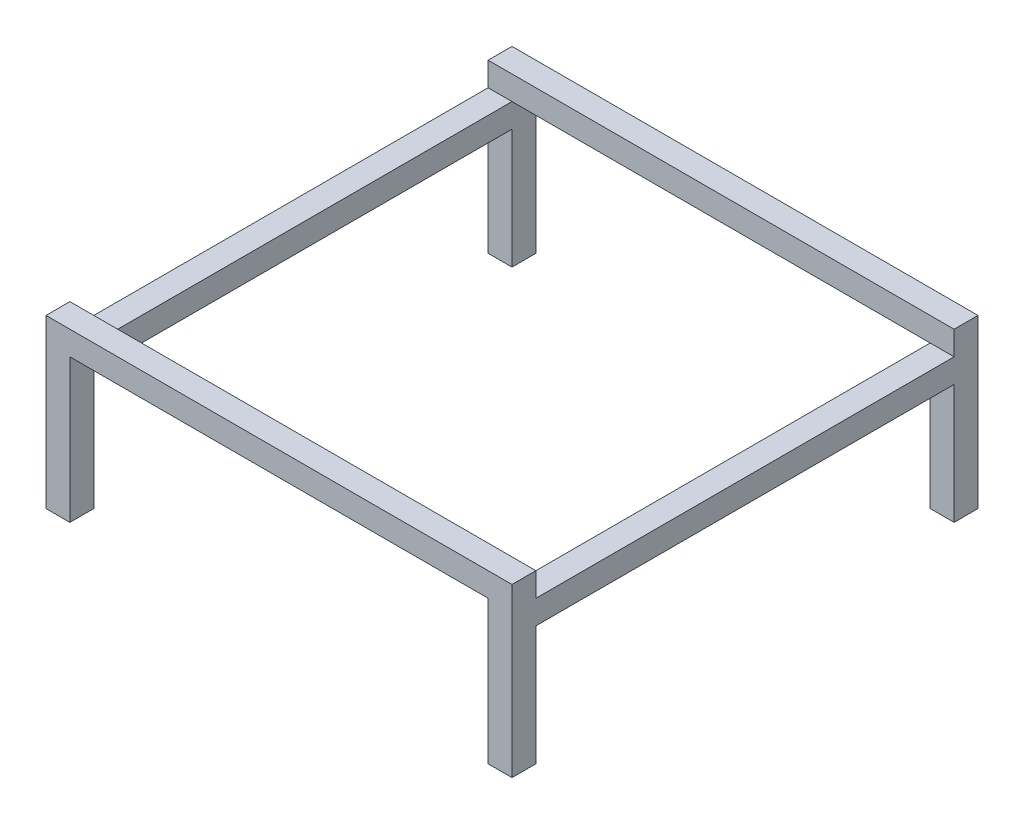
ISO-10303-21;
HEADER;
FILE_DESCRIPTION(('STEP AP214'),'2;1');
FILE_NAME('part.step','',(''),(''),'','','');
FILE_SCHEMA(('AUTOMOTIVE_DESIGN { 1 0 10303 214 1 1 1 1 }'));
ENDSEC;
DATA;
#1=APPLICATION_CONTEXT('core data for automotive mechanical design processes');
#2=APPLICATION_PROTOCOL_DEFINITION('international standard','automotive_design',2000,#1);
#3=PRODUCT_CONTEXT('',#1,'mechanical');
#4=PRODUCT('Part','Part','',(#3));
#5=PRODUCT_RELATED_PRODUCT_CATEGORY('part','',(#4));
#6=PRODUCT_DEFINITION_FORMATION('','',#4);
#7=PRODUCT_DEFINITION_CONTEXT('part definition',#1,'design');
#8=PRODUCT_DEFINITION('design','',#6,#7);
#9=PRODUCT_DEFINITION_SHAPE('','',#8);
#10=(LENGTH_UNIT() NAMED_UNIT(*) SI_UNIT(.MILLI.,.METRE.));
#11=(NAMED_UNIT(*) PLANE_ANGLE_UNIT() SI_UNIT($,.RADIAN.));
#12=(NAMED_UNIT(*) SI_UNIT($,.STERADIAN.) SOLID_ANGLE_UNIT());
#13=UNCERTAINTY_MEASURE_WITH_UNIT(LENGTH_MEASURE(1.E-05),#10,'distance_accuracy_value','');
#14=(GEOMETRIC_REPRESENTATION_CONTEXT(3) GLOBAL_UNCERTAINTY_ASSIGNED_CONTEXT((#13)) GLOBAL_UNIT_ASSIGNED_CONTEXT((#10,
#11,#12)) REPRESENTATION_CONTEXT('',''));
#15=CARTESIAN_POINT('',(0.,0.,0.));
#16=DIRECTION('',(0.,0.,1.));
#17=DIRECTION('',(1.,0.,0.));
#18=AXIS2_PLACEMENT_3D('',#15,#16,#17);
#19=CARTESIAN_POINT('',(0.,20.,0.));
#20=DIRECTION('',(0.,-1.,0.));
#21=DIRECTION('',(0.,0.,-1.));
#22=AXIS2_PLACEMENT_3D('',#19,#20,#21);
#23=PLANE('',#22);
#24=DIRECTION('',(1.,0.,0.));
#25=VECTOR('',#24,1.);
#26=CARTESIAN_POINT('',(-195.,20.,-175.));
#27=LINE('',#26,#25);
#28=CARTESIAN_POINT('',(-195.,20.,-175.));
#29=VERTEX_POINT('',#28);
#30=CARTESIAN_POINT('',(-175.,20.,-175.));
#31=VERTEX_POINT('',#30);
#32=EDGE_CURVE('E228',#29,#31,#27,.T.);
#33=ORIENTED_EDGE('',*,*,#32,.F.);
#34=DIRECTION('',(0.,0.,1.));
#35=VECTOR('',#34,1.);
#36=CARTESIAN_POINT('',(-195.,20.,195.));
#37=LINE('',#36,#35);
#38=CARTESIAN_POINT('',(-195.,20.,175.));
#39=VERTEX_POINT('',#38);
#40=EDGE_CURVE('E343',#29,#39,#37,.T.);
#41=ORIENTED_EDGE('',*,*,#40,.T.);
#42=DIRECTION('',(-1.,0.,0.));
#43=VECTOR('',#42,1.);
#44=CARTESIAN_POINT('',(-195.,20.,175.));
#45=LINE('',#44,#43);
#46=CARTESIAN_POINT('',(-175.,20.,175.));
#47=VERTEX_POINT('',#46);
#48=EDGE_CURVE('E43',#47,#39,#45,.T.);
#49=ORIENTED_EDGE('',*,*,#48,.F.);
#50=DIRECTION('',(0.,0.,1.));
#51=VECTOR('',#50,1.);
#52=CARTESIAN_POINT('',(-175.,20.,175.));
#53=LINE('',#52,#51);
#54=EDGE_CURVE('E332',#31,#47,#53,.T.);
#55=ORIENTED_EDGE('',*,*,#54,.F.);
#56=EDGE_LOOP('',(#33,#41,#49,#55));
#57=FACE_BOUND('',#56,.T.);
#58=ADVANCED_FACE('F35',(#57),#23,.F.);
#59=CARTESIAN_POINT('',(175.,20.,-175.));
#60=VERTEX_POINT('',#59);
#61=CARTESIAN_POINT('',(195.,20.,-175.));
#62=VERTEX_POINT('',#61);
#63=EDGE_CURVE('E223',#60,#62,#27,.T.);
#64=ORIENTED_EDGE('',*,*,#63,.F.);
#65=DIRECTION('',(0.,0.,-1.));
#66=VECTOR('',#65,1.);
#67=CARTESIAN_POINT('',(175.,20.,175.));
#68=LINE('',#67,#66);
#69=CARTESIAN_POINT('',(175.,20.,175.));
#70=VERTEX_POINT('',#69);
#71=EDGE_CURVE('E204',#70,#60,#68,.T.);
#72=ORIENTED_EDGE('',*,*,#71,.F.);
#73=CARTESIAN_POINT('',(195.,20.,175.));
#74=VERTEX_POINT('',#73);
#75=EDGE_CURVE('E50',#74,#70,#45,.T.);
#76=ORIENTED_EDGE('',*,*,#75,.F.);
#77=DIRECTION('',(0.,0.,-1.));
#78=VECTOR('',#77,1.);
#79=CARTESIAN_POINT('',(195.,20.,195.));
#80=LINE('',#79,#78);
#81=EDGE_CURVE('E341',#74,#62,#80,.T.);
#82=ORIENTED_EDGE('',*,*,#81,.T.);
#83=EDGE_LOOP('',(#64,#72,#76,#82));
#84=FACE_BOUND('',#83,.T.);
#85=ADVANCED_FACE('F380',(#84),#23,.F.);
#86=CARTESIAN_POINT('',(0.,0.,0.));
#87=DIRECTION('',(0.,-1.,0.));
#88=DIRECTION('',(0.,0.,-1.));
#89=AXIS2_PLACEMENT_3D('',#86,#87,#88);
#90=PLANE('',#89);
#91=DIRECTION('',(0.,0.,1.));
#92=VECTOR('',#91,1.);
#93=CARTESIAN_POINT('',(-195.,0.,195.));
#94=LINE('',#93,#92);
#95=CARTESIAN_POINT('',(-195.,0.,-175.));
#96=VERTEX_POINT('',#95);
#97=CARTESIAN_POINT('',(-195.,0.,175.));
#98=VERTEX_POINT('',#97);
#99=EDGE_CURVE('E344',#96,#98,#94,.T.);
#100=ORIENTED_EDGE('',*,*,#99,.F.);
#101=DIRECTION('',(-1.,0.,0.));
#102=VECTOR('',#101,1.);
#103=CARTESIAN_POINT('',(-195.,0.,-175.));
#104=LINE('',#103,#102);
#105=CARTESIAN_POINT('',(-175.,0.,-175.));
#106=VERTEX_POINT('',#105);
#107=EDGE_CURVE('E260',#106,#96,#104,.T.);
#108=ORIENTED_EDGE('',*,*,#107,.F.);
#109=DIRECTION('',(0.,0.,1.));
#110=VECTOR('',#109,1.);
#111=CARTESIAN_POINT('',(-175.,0.,175.));
#112=LINE('',#111,#110);
#113=CARTESIAN_POINT('',(-175.,0.,175.));
#114=VERTEX_POINT('',#113);
#115=EDGE_CURVE('E331',#106,#114,#112,.T.);
#116=ORIENTED_EDGE('',*,*,#115,.T.);
#117=DIRECTION('',(1.,0.,0.));
#118=VECTOR('',#117,1.);
#119=CARTESIAN_POINT('',(-195.,0.,175.));
#120=LINE('',#119,#118);
#121=EDGE_CURVE('E310',#98,#114,#120,.T.);
#122=ORIENTED_EDGE('',*,*,#121,.F.);
#123=EDGE_LOOP('',(#100,#108,#116,#122));
#124=FACE_BOUND('',#123,.T.);
#125=ADVANCED_FACE('F435',(#124),#90,.T.);
#126=DIRECTION('',(0.,0.,-1.));
#127=VECTOR('',#126,1.);
#128=CARTESIAN_POINT('',(175.,0.,175.));
#129=LINE('',#128,#127);
#130=CARTESIAN_POINT('',(175.,0.,175.));
#131=VERTEX_POINT('',#130);
#132=CARTESIAN_POINT('',(175.,0.,-175.));
#133=VERTEX_POINT('',#132);
#134=EDGE_CURVE('E335',#131,#133,#129,.T.);
#135=ORIENTED_EDGE('',*,*,#134,.T.);
#136=DIRECTION('',(-1.,0.,0.));
#137=VECTOR('',#136,1.);
#138=CARTESIAN_POINT('',(195.,0.,-175.));
#139=LINE('',#138,#137);
#140=CARTESIAN_POINT('',(195.,0.,-175.));
#141=VERTEX_POINT('',#140);
#142=EDGE_CURVE('E277',#141,#133,#139,.T.);
#143=ORIENTED_EDGE('',*,*,#142,.F.);
#144=DIRECTION('',(0.,0.,-1.));
#145=VECTOR('',#144,1.);
#146=CARTESIAN_POINT('',(195.,0.,195.));
#147=LINE('',#146,#145);
#148=CARTESIAN_POINT('',(195.,0.,175.));
#149=VERTEX_POINT('',#148);
#150=EDGE_CURVE('E337',#149,#141,#147,.T.);
#151=ORIENTED_EDGE('',*,*,#150,.F.);
#152=DIRECTION('',(1.,0.,0.));
#153=VECTOR('',#152,1.);
#154=CARTESIAN_POINT('',(195.,0.,175.));
#155=LINE('',#154,#153);
#156=EDGE_CURVE('E291',#131,#149,#155,.T.);
#157=ORIENTED_EDGE('',*,*,#156,.F.);
#158=EDGE_LOOP('',(#135,#143,#151,#157));
#159=FACE_BOUND('',#158,.T.);
#160=ADVANCED_FACE('F407',(#159),#90,.T.);
#161=CARTESIAN_POINT('',(195.,20.,195.));
#162=DIRECTION('',(0.,0.,-1.));
#163=DIRECTION('',(-1.,0.,0.));
#164=AXIS2_PLACEMENT_3D('',#161,#162,#163);
#165=PLANE('',#164);
#166=DIRECTION('',(0.,1.,0.));
#167=VECTOR('',#166,1.);
#168=CARTESIAN_POINT('',(-175.,-100.,195.));
#169=LINE('',#168,#167);
#170=CARTESIAN_POINT('',(-175.,-100.,195.));
#171=VERTEX_POINT('',#170);
#172=CARTESIAN_POINT('',(-175.,20.,195.));
#173=VERTEX_POINT('',#172);
#174=EDGE_CURVE('E321',#171,#173,#169,.T.);
#175=ORIENTED_EDGE('',*,*,#174,.T.);
#176=DIRECTION('',(1.,0.,0.));
#177=VECTOR('',#176,1.);
#178=CARTESIAN_POINT('',(195.,20.,195.));
#179=LINE('',#178,#177);
#180=CARTESIAN_POINT('',(175.,20.,195.));
#181=VERTEX_POINT('',#180);
#182=EDGE_CURVE('E220',#173,#181,#179,.T.);
#183=ORIENTED_EDGE('',*,*,#182,.T.);
#184=DIRECTION('',(0.,1.,0.));
#185=VECTOR('',#184,1.);
#186=CARTESIAN_POINT('',(175.,-100.,195.));
#187=LINE('',#186,#185);
#188=CARTESIAN_POINT('',(175.,-100.,195.));
#189=VERTEX_POINT('',#188);
#190=EDGE_CURVE('E308',#189,#181,#187,.T.);
#191=ORIENTED_EDGE('',*,*,#190,.F.);
#192=DIRECTION('',(-1.,0.,0.));
#193=VECTOR('',#192,1.);
#194=CARTESIAN_POINT('',(195.,-100.,195.));
#195=LINE('',#194,#193);
#196=CARTESIAN_POINT('',(195.,-100.,195.));
#197=VERTEX_POINT('',#196);
#198=EDGE_CURVE('E292',#197,#189,#195,.T.);
#199=ORIENTED_EDGE('',*,*,#198,.F.);
#200=DIRECTION('',(0.,-1.,0.));
#201=VECTOR('',#200,1.);
#202=CARTESIAN_POINT('',(195.,20.,195.));
#203=LINE('',#202,#201);
#204=CARTESIAN_POINT('',(195.,40.,195.));
#205=VERTEX_POINT('',#204);
#206=EDGE_CURVE('E354',#205,#197,#203,.T.);
#207=ORIENTED_EDGE('',*,*,#206,.F.);
#208=DIRECTION('',(1.,0.,0.));
#209=VECTOR('',#208,1.);
#210=CARTESIAN_POINT('',(-195.,40.,195.));
#211=LINE('',#210,#209);
#212=CARTESIAN_POINT('',(-195.,40.,195.));
#213=VERTEX_POINT('',#212);
#214=EDGE_CURVE('E246',#213,#205,#211,.T.);
#215=ORIENTED_EDGE('',*,*,#214,.F.);
#216=DIRECTION('',(0.,-1.,0.));
#217=VECTOR('',#216,1.);
#218=CARTESIAN_POINT('',(-195.,20.,195.));
#219=LINE('',#218,#217);
#220=CARTESIAN_POINT('',(-195.,-100.,195.));
#221=VERTEX_POINT('',#220);
#222=EDGE_CURVE('E346',#213,#221,#219,.T.);
#223=ORIENTED_EDGE('',*,*,#222,.T.);
#224=DIRECTION('',(-1.,0.,0.));
#225=VECTOR('',#224,1.);
#226=CARTESIAN_POINT('',(-195.,-100.,195.));
#227=LINE('',#226,#225);
#228=EDGE_CURVE('E318',#171,#221,#227,.T.);
#229=ORIENTED_EDGE('',*,*,#228,.F.);
#230=EDGE_LOOP('',(#175,#183,#191,#199,#207,#215,#223,#229));
#231=FACE_BOUND('',#230,.T.);
#232=ADVANCED_FACE('F37',(#231),#165,.F.);
#233=CARTESIAN_POINT('',(195.,20.,195.));
#234=DIRECTION('',(-1.,0.,0.));
#235=DIRECTION('',(0.,0.,1.));
#236=AXIS2_PLACEMENT_3D('',#233,#234,#235);
#237=PLANE('',#236);
#238=ORIENTED_EDGE('',*,*,#206,.T.);
#239=DIRECTION('',(0.,0.,1.));
#240=VECTOR('',#239,1.);
#241=CARTESIAN_POINT('',(195.,-100.,195.));
#242=LINE('',#241,#240);
#243=CARTESIAN_POINT('',(195.,-100.,175.));
#244=VERTEX_POINT('',#243);
#245=EDGE_CURVE('E299',#244,#197,#242,.T.);
#246=ORIENTED_EDGE('',*,*,#245,.F.);
#247=DIRECTION('',(0.,1.,0.));
#248=VECTOR('',#247,1.);
#249=CARTESIAN_POINT('',(195.,-100.,175.));
#250=LINE('',#249,#248);
#251=EDGE_CURVE('E302',#244,#149,#250,.T.);
#252=ORIENTED_EDGE('',*,*,#251,.T.);
#253=ORIENTED_EDGE('',*,*,#150,.T.);
#254=DIRECTION('',(0.,1.,0.));
#255=VECTOR('',#254,1.);
#256=CARTESIAN_POINT('',(195.,-100.,-175.));
#257=LINE('',#256,#255);
#258=CARTESIAN_POINT('',(195.,-100.,-175.));
#259=VERTEX_POINT('',#258);
#260=EDGE_CURVE('E289',#259,#141,#257,.T.);
#261=ORIENTED_EDGE('',*,*,#260,.F.);
#262=DIRECTION('',(0.,0.,1.));
#263=VECTOR('',#262,1.);
#264=CARTESIAN_POINT('',(195.,-100.,-195.));
#265=LINE('',#264,#263);
#266=CARTESIAN_POINT('',(195.,-100.,-195.));
#267=VERTEX_POINT('',#266);
#268=EDGE_CURVE('E278',#267,#259,#265,.T.);
#269=ORIENTED_EDGE('',*,*,#268,.F.);
#270=DIRECTION('',(0.,-1.,0.));
#271=VECTOR('',#270,1.);
#272=CARTESIAN_POINT('',(195.,20.,-195.));
#273=LINE('',#272,#271);
#274=CARTESIAN_POINT('',(195.,40.,-195.));
#275=VERTEX_POINT('',#274);
#276=EDGE_CURVE('E353',#275,#267,#273,.T.);
#277=ORIENTED_EDGE('',*,*,#276,.F.);
#278=DIRECTION('',(0.,0.,-1.));
#279=VECTOR('',#278,1.);
#280=CARTESIAN_POINT('',(195.,40.,-195.));
#281=LINE('',#280,#279);
#282=CARTESIAN_POINT('',(195.,40.,-175.));
#283=VERTEX_POINT('',#282);
#284=EDGE_CURVE('E230',#283,#275,#281,.T.);
#285=ORIENTED_EDGE('',*,*,#284,.F.);
#286=DIRECTION('',(0.,-1.,0.));
#287=VECTOR('',#286,1.);
#288=CARTESIAN_POINT('',(195.,40.,-175.));
#289=LINE('',#288,#287);
#290=EDGE_CURVE('E236',#283,#62,#289,.T.);
#291=ORIENTED_EDGE('',*,*,#290,.T.);
#292=ORIENTED_EDGE('',*,*,#81,.F.);
#293=DIRECTION('',(0.,-1.,0.));
#294=VECTOR('',#293,1.);
#295=CARTESIAN_POINT('',(195.,40.,175.));
#296=LINE('',#295,#294);
#297=CARTESIAN_POINT('',(195.,40.,175.));
#298=VERTEX_POINT('',#297);
#299=EDGE_CURVE('E257',#298,#74,#296,.T.);
#300=ORIENTED_EDGE('',*,*,#299,.F.);
#301=DIRECTION('',(0.,0.,-1.));
#302=VECTOR('',#301,1.);
#303=CARTESIAN_POINT('',(195.,40.,195.));
#304=LINE('',#303,#302);
#305=EDGE_CURVE('E249',#205,#298,#304,.T.);
#306=ORIENTED_EDGE('',*,*,#305,.F.);
#307=EDGE_LOOP('',(#238,#246,#252,#253,#261,#269,#277,#285,#291,#292,#300,#306));
#308=FACE_BOUND('',#307,.T.);
#309=ADVANCED_FACE('F376',(#308),#237,.F.);
#310=CARTESIAN_POINT('',(195.,20.,-195.));
#311=DIRECTION('',(0.,0.,1.));
#312=DIRECTION('',(1.,0.,0.));
#313=AXIS2_PLACEMENT_3D('',#310,#311,#312);
#314=PLANE('',#313);
#315=DIRECTION('',(-1.,0.,0.));
#316=VECTOR('',#315,1.);
#317=CARTESIAN_POINT('',(-175.,20.,-195.));
#318=LINE('',#317,#316);
#319=CARTESIAN_POINT('',(175.,20.,-195.));
#320=VERTEX_POINT('',#319);
#321=CARTESIAN_POINT('',(-175.,20.,-195.));
#322=VERTEX_POINT('',#321);
#323=EDGE_CURVE('E192',#320,#322,#318,.T.);
#324=ORIENTED_EDGE('',*,*,#323,.T.);
#325=DIRECTION('',(0.,1.,0.));
#326=VECTOR('',#325,1.);
#327=CARTESIAN_POINT('',(-175.,-100.,-195.));
#328=LINE('',#327,#326);
#329=CARTESIAN_POINT('',(-175.,-100.,-195.));
#330=VERTEX_POINT('',#329);
#331=EDGE_CURVE('E275',#330,#322,#328,.T.);
#332=ORIENTED_EDGE('',*,*,#331,.F.);
#333=DIRECTION('',(1.,0.,0.));
#334=VECTOR('',#333,1.);
#335=CARTESIAN_POINT('',(-195.,-100.,-195.));
#336=LINE('',#335,#334);
#337=CARTESIAN_POINT('',(-195.,-100.,-195.));
#338=VERTEX_POINT('',#337);
#339=EDGE_CURVE('E261',#338,#330,#336,.T.);
#340=ORIENTED_EDGE('',*,*,#339,.F.);
#341=DIRECTION('',(0.,-1.,0.));
#342=VECTOR('',#341,1.);
#343=CARTESIAN_POINT('',(-195.,20.,-195.));
#344=LINE('',#343,#342);
#345=CARTESIAN_POINT('',(-195.,40.,-195.));
#346=VERTEX_POINT('',#345);
#347=EDGE_CURVE('E351',#346,#338,#344,.T.);
#348=ORIENTED_EDGE('',*,*,#347,.F.);
#349=DIRECTION('',(-1.,0.,0.));
#350=VECTOR('',#349,1.);
#351=CARTESIAN_POINT('',(-195.,40.,-195.));
#352=LINE('',#351,#350);
#353=EDGE_CURVE('E233',#275,#346,#352,.T.);
#354=ORIENTED_EDGE('',*,*,#353,.F.);
#355=ORIENTED_EDGE('',*,*,#276,.T.);
#356=DIRECTION('',(1.,0.,0.));
#357=VECTOR('',#356,1.);
#358=CARTESIAN_POINT('',(195.,-100.,-195.));
#359=LINE('',#358,#357);
#360=CARTESIAN_POINT('',(175.,-100.,-195.));
#361=VERTEX_POINT('',#360);
#362=EDGE_CURVE('E194',#361,#267,#359,.T.);
#363=ORIENTED_EDGE('',*,*,#362,.F.);
#364=DIRECTION('',(0.,1.,0.));
#365=VECTOR('',#364,1.);
#366=CARTESIAN_POINT('',(175.,-100.,-195.));
#367=LINE('',#366,#365);
#368=EDGE_CURVE('E187',#361,#320,#367,.T.);
#369=ORIENTED_EDGE('',*,*,#368,.T.);
#370=EDGE_LOOP('',(#324,#332,#340,#348,#354,#355,#363,#369));
#371=FACE_BOUND('',#370,.T.);
#372=ADVANCED_FACE('F189',(#371),#314,.F.);
#373=CARTESIAN_POINT('',(-195.,20.,195.));
#374=DIRECTION('',(1.,0.,0.));
#375=DIRECTION('',(0.,0.,-1.));
#376=AXIS2_PLACEMENT_3D('',#373,#374,#375);
#377=PLANE('',#376);
#378=ORIENTED_EDGE('',*,*,#347,.T.);
#379=DIRECTION('',(0.,0.,-1.));
#380=VECTOR('',#379,1.);
#381=CARTESIAN_POINT('',(-195.,-100.,-195.));
#382=LINE('',#381,#380);
#383=CARTESIAN_POINT('',(-195.,-100.,-175.));
#384=VERTEX_POINT('',#383);
#385=EDGE_CURVE('E268',#384,#338,#382,.T.);
#386=ORIENTED_EDGE('',*,*,#385,.F.);
#387=DIRECTION('',(0.,1.,0.));
#388=VECTOR('',#387,1.);
#389=CARTESIAN_POINT('',(-195.,-100.,-175.));
#390=LINE('',#389,#388);
#391=EDGE_CURVE('E58',#384,#96,#390,.T.);
#392=ORIENTED_EDGE('',*,*,#391,.T.);
#393=ORIENTED_EDGE('',*,*,#99,.T.);
#394=DIRECTION('',(0.,1.,0.));
#395=VECTOR('',#394,1.);
#396=CARTESIAN_POINT('',(-195.,-100.,175.));
#397=LINE('',#396,#395);
#398=CARTESIAN_POINT('',(-195.,-100.,175.));
#399=VERTEX_POINT('',#398);
#400=EDGE_CURVE('E328',#399,#98,#397,.T.);
#401=ORIENTED_EDGE('',*,*,#400,.F.);
#402=DIRECTION('',(0.,0.,-1.));
#403=VECTOR('',#402,1.);
#404=CARTESIAN_POINT('',(-195.,-100.,195.));
#405=LINE('',#404,#403);
#406=EDGE_CURVE('E311',#221,#399,#405,.T.);
#407=ORIENTED_EDGE('',*,*,#406,.F.);
#408=ORIENTED_EDGE('',*,*,#222,.F.);
#409=DIRECTION('',(0.,0.,1.));
#410=VECTOR('',#409,1.);
#411=CARTESIAN_POINT('',(-195.,40.,195.));
#412=LINE('',#411,#410);
#413=CARTESIAN_POINT('',(-195.,40.,175.));
#414=VERTEX_POINT('',#413);
#415=EDGE_CURVE('E243',#414,#213,#412,.T.);
#416=ORIENTED_EDGE('',*,*,#415,.F.);
#417=DIRECTION('',(0.,-1.,0.));
#418=VECTOR('',#417,1.);
#419=CARTESIAN_POINT('',(-195.,40.,175.));
#420=LINE('',#419,#418);
#421=EDGE_CURVE('E253',#414,#39,#420,.T.);
#422=ORIENTED_EDGE('',*,*,#421,.T.);
#423=ORIENTED_EDGE('',*,*,#40,.F.);
#424=DIRECTION('',(0.,-1.,0.));
#425=VECTOR('',#424,1.);
#426=CARTESIAN_POINT('',(-195.,40.,-175.));
#427=LINE('',#426,#425);
#428=CARTESIAN_POINT('',(-195.,40.,-175.));
#429=VERTEX_POINT('',#428);
#430=EDGE_CURVE('E241',#429,#29,#427,.T.);
#431=ORIENTED_EDGE('',*,*,#430,.F.);
#432=DIRECTION('',(0.,0.,1.));
#433=VECTOR('',#432,1.);
#434=CARTESIAN_POINT('',(-195.,40.,-195.));
#435=LINE('',#434,#433);
#436=EDGE_CURVE('E224',#346,#429,#435,.T.);
#437=ORIENTED_EDGE('',*,*,#436,.F.);
#438=EDGE_LOOP('',(#378,#386,#392,#393,#401,#407,#408,#416,#422,#423,#431,#437));
#439=FACE_BOUND('',#438,.T.);
#440=ADVANCED_FACE('F369',(#439),#377,.F.);
#441=CARTESIAN_POINT('',(-175.,20.,175.));
#442=DIRECTION('',(1.,0.,0.));
#443=DIRECTION('',(0.,0.,-1.));
#444=AXIS2_PLACEMENT_3D('',#441,#442,#443);
#445=PLANE('',#444);
#446=ORIENTED_EDGE('',*,*,#115,.F.);
#447=DIRECTION('',(0.,1.,0.));
#448=VECTOR('',#447,1.);
#449=CARTESIAN_POINT('',(-175.,-100.,-175.));
#450=LINE('',#449,#448);
#451=CARTESIAN_POINT('',(-175.,-100.,-175.));
#452=VERTEX_POINT('',#451);
#453=EDGE_CURVE('E273',#452,#106,#450,.T.);
#454=ORIENTED_EDGE('',*,*,#453,.F.);
#455=DIRECTION('',(0.,0.,1.));
#456=VECTOR('',#455,1.);
#457=CARTESIAN_POINT('',(-175.,-100.,-195.));
#458=LINE('',#457,#456);
#459=EDGE_CURVE('E264',#330,#452,#458,.T.);
#460=ORIENTED_EDGE('',*,*,#459,.F.);
#461=ORIENTED_EDGE('',*,*,#331,.T.);
#462=DIRECTION('',(0.,0.,1.));
#463=VECTOR('',#462,1.);
#464=CARTESIAN_POINT('',(-175.,20.,-195.));
#465=LINE('',#464,#463);
#466=EDGE_CURVE('E213',#322,#31,#465,.T.);
#467=ORIENTED_EDGE('',*,*,#466,.T.);
#468=ORIENTED_EDGE('',*,*,#54,.T.);
#469=EDGE_CURVE('E207',#47,#173,#465,.T.);
#470=ORIENTED_EDGE('',*,*,#469,.T.);
#471=ORIENTED_EDGE('',*,*,#174,.F.);
#472=DIRECTION('',(0.,0.,1.));
#473=VECTOR('',#472,1.);
#474=CARTESIAN_POINT('',(-175.,-100.,195.));
#475=LINE('',#474,#473);
#476=CARTESIAN_POINT('',(-175.,-100.,175.));
#477=VERTEX_POINT('',#476);
#478=EDGE_CURVE('E316',#477,#171,#475,.T.);
#479=ORIENTED_EDGE('',*,*,#478,.F.);
#480=DIRECTION('',(0.,1.,0.));
#481=VECTOR('',#480,1.);
#482=CARTESIAN_POINT('',(-175.,-100.,175.));
#483=LINE('',#482,#481);
#484=EDGE_CURVE('E325',#477,#114,#483,.T.);
#485=ORIENTED_EDGE('',*,*,#484,.T.);
#486=EDGE_LOOP('',(#446,#454,#460,#461,#467,#468,#470,#471,#479,#485));
#487=FACE_BOUND('',#486,.T.);
#488=ADVANCED_FACE('F386',(#487),#445,.T.);
#489=CARTESIAN_POINT('',(175.,20.,175.));
#490=DIRECTION('',(0.,0.,-1.));
#491=DIRECTION('',(-1.,0.,0.));
#492=AXIS2_PLACEMENT_3D('',#489,#490,#491);
#493=PLANE('',#492);
#494=DIRECTION('',(1.,0.,0.));
#495=VECTOR('',#494,1.);
#496=CARTESIAN_POINT('',(175.,20.,175.));
#497=LINE('',#496,#495);
#498=EDGE_CURVE('E217',#47,#70,#497,.T.);
#499=ORIENTED_EDGE('',*,*,#498,.F.);
#500=ORIENTED_EDGE('',*,*,#48,.T.);
#501=ORIENTED_EDGE('',*,*,#421,.F.);
#502=DIRECTION('',(-1.,0.,0.));
#503=VECTOR('',#502,1.);
#504=CARTESIAN_POINT('',(-195.,40.,175.));
#505=LINE('',#504,#503);
#506=EDGE_CURVE('E251',#298,#414,#505,.T.);
#507=ORIENTED_EDGE('',*,*,#506,.F.);
#508=ORIENTED_EDGE('',*,*,#299,.T.);
#509=ORIENTED_EDGE('',*,*,#75,.T.);
#510=EDGE_LOOP('',(#499,#500,#501,#507,#508,#509));
#511=FACE_BOUND('',#510,.T.);
#512=ADVANCED_FACE('F363',(#511),#493,.T.);
#513=CARTESIAN_POINT('',(175.,20.,175.));
#514=DIRECTION('',(-1.,0.,0.));
#515=DIRECTION('',(0.,0.,1.));
#516=AXIS2_PLACEMENT_3D('',#513,#514,#515);
#517=PLANE('',#516);
#518=ORIENTED_EDGE('',*,*,#134,.F.);
#519=DIRECTION('',(0.,1.,0.));
#520=VECTOR('',#519,1.);
#521=CARTESIAN_POINT('',(175.,-100.,175.));
#522=LINE('',#521,#520);
#523=CARTESIAN_POINT('',(175.,-100.,175.));
#524=VERTEX_POINT('',#523);
#525=EDGE_CURVE('E306',#524,#131,#522,.T.);
#526=ORIENTED_EDGE('',*,*,#525,.F.);
#527=DIRECTION('',(0.,0.,-1.));
#528=VECTOR('',#527,1.);
#529=CARTESIAN_POINT('',(175.,-100.,195.));
#530=LINE('',#529,#528);
#531=EDGE_CURVE('E295',#189,#524,#530,.T.);
#532=ORIENTED_EDGE('',*,*,#531,.F.);
#533=ORIENTED_EDGE('',*,*,#190,.T.);
#534=DIRECTION('',(0.,0.,1.));
#535=VECTOR('',#534,1.);
#536=CARTESIAN_POINT('',(175.,20.,-195.));
#537=LINE('',#536,#535);
#538=EDGE_CURVE('E208',#70,#181,#537,.T.);
#539=ORIENTED_EDGE('',*,*,#538,.F.);
#540=ORIENTED_EDGE('',*,*,#71,.T.);
#541=EDGE_CURVE('E200',#320,#60,#537,.T.);
#542=ORIENTED_EDGE('',*,*,#541,.F.);
#543=ORIENTED_EDGE('',*,*,#368,.F.);
#544=DIRECTION('',(0.,0.,-1.));
#545=VECTOR('',#544,1.);
#546=CARTESIAN_POINT('',(175.,-100.,-195.));
#547=LINE('',#546,#545);
#548=CARTESIAN_POINT('',(175.,-100.,-175.));
#549=VERTEX_POINT('',#548);
#550=EDGE_CURVE('E283',#549,#361,#547,.T.);
#551=ORIENTED_EDGE('',*,*,#550,.F.);
#552=DIRECTION('',(0.,1.,0.));
#553=VECTOR('',#552,1.);
#554=CARTESIAN_POINT('',(175.,-100.,-175.));
#555=LINE('',#554,#553);
#556=EDGE_CURVE('E197',#549,#133,#555,.T.);
#557=ORIENTED_EDGE('',*,*,#556,.T.);
#558=EDGE_LOOP('',(#518,#526,#532,#533,#539,#540,#542,#543,#551,#557));
#559=FACE_BOUND('',#558,.T.);
#560=ADVANCED_FACE('F202',(#559),#517,.T.);
#561=CARTESIAN_POINT('',(175.,20.,-175.));
#562=DIRECTION('',(0.,0.,1.));
#563=DIRECTION('',(1.,0.,0.));
#564=AXIS2_PLACEMENT_3D('',#561,#562,#563);
#565=PLANE('',#564);
#566=DIRECTION('',(-1.,0.,0.));
#567=VECTOR('',#566,1.);
#568=CARTESIAN_POINT('',(175.,20.,-175.));
#569=LINE('',#568,#567);
#570=EDGE_CURVE('E11',#60,#31,#569,.T.);
#571=ORIENTED_EDGE('',*,*,#570,.F.);
#572=ORIENTED_EDGE('',*,*,#63,.T.);
#573=ORIENTED_EDGE('',*,*,#290,.F.);
#574=DIRECTION('',(1.,0.,0.));
#575=VECTOR('',#574,1.);
#576=CARTESIAN_POINT('',(-195.,40.,-175.));
#577=LINE('',#576,#575);
#578=EDGE_CURVE('E227',#429,#283,#577,.T.);
#579=ORIENTED_EDGE('',*,*,#578,.F.);
#580=ORIENTED_EDGE('',*,*,#430,.T.);
#581=ORIENTED_EDGE('',*,*,#32,.T.);
#582=EDGE_LOOP('',(#571,#572,#573,#579,#580,#581));
#583=FACE_BOUND('',#582,.T.);
#584=ADVANCED_FACE('F382',(#583),#565,.T.);
#585=CARTESIAN_POINT('',(-195.,-100.,175.));
#586=DIRECTION('',(0.,0.,1.));
#587=DIRECTION('',(1.,0.,0.));
#588=AXIS2_PLACEMENT_3D('',#585,#586,#587);
#589=PLANE('',#588);
#590=ORIENTED_EDGE('',*,*,#121,.T.);
#591=ORIENTED_EDGE('',*,*,#484,.F.);
#592=DIRECTION('',(1.,0.,0.));
#593=VECTOR('',#592,1.);
#594=CARTESIAN_POINT('',(-195.,-100.,175.));
#595=LINE('',#594,#593);
#596=EDGE_CURVE('E314',#399,#477,#595,.T.);
#597=ORIENTED_EDGE('',*,*,#596,.F.);
#598=ORIENTED_EDGE('',*,*,#400,.T.);
#599=EDGE_LOOP('',(#590,#591,#597,#598));
#600=FACE_BOUND('',#599,.T.);
#601=ADVANCED_FACE('F431',(#600),#589,.F.);
#602=CARTESIAN_POINT('',(0.,-100.,0.));
#603=DIRECTION('',(0.,-1.,0.));
#604=DIRECTION('',(0.,0.,-1.));
#605=AXIS2_PLACEMENT_3D('',#602,#603,#604);
#606=PLANE('',#605);
#607=ORIENTED_EDGE('',*,*,#406,.T.);
#608=ORIENTED_EDGE('',*,*,#596,.T.);
#609=ORIENTED_EDGE('',*,*,#478,.T.);
#610=ORIENTED_EDGE('',*,*,#228,.T.);
#611=EDGE_LOOP('',(#607,#608,#609,#610));
#612=FACE_BOUND('',#611,.T.);
#613=ADVANCED_FACE('F426',(#612),#606,.T.);
#614=CARTESIAN_POINT('',(195.,-100.,175.));
#615=DIRECTION('',(0.,0.,1.));
#616=DIRECTION('',(1.,0.,0.));
#617=AXIS2_PLACEMENT_3D('',#614,#615,#616);
#618=PLANE('',#617);
#619=ORIENTED_EDGE('',*,*,#156,.T.);
#620=ORIENTED_EDGE('',*,*,#251,.F.);
#621=DIRECTION('',(1.,0.,0.));
#622=VECTOR('',#621,1.);
#623=CARTESIAN_POINT('',(195.,-100.,175.));
#624=LINE('',#623,#622);
#625=EDGE_CURVE('E297',#524,#244,#624,.T.);
#626=ORIENTED_EDGE('',*,*,#625,.F.);
#627=ORIENTED_EDGE('',*,*,#525,.T.);
#628=EDGE_LOOP('',(#619,#620,#626,#627));
#629=FACE_BOUND('',#628,.T.);
#630=ADVANCED_FACE('F413',(#629),#618,.F.);
#631=CARTESIAN_POINT('',(0.,-100.,0.));
#632=DIRECTION('',(0.,-1.,0.));
#633=DIRECTION('',(0.,0.,-1.));
#634=AXIS2_PLACEMENT_3D('',#631,#632,#633);
#635=PLANE('',#634);
#636=ORIENTED_EDGE('',*,*,#198,.T.);
#637=ORIENTED_EDGE('',*,*,#531,.T.);
#638=ORIENTED_EDGE('',*,*,#625,.T.);
#639=ORIENTED_EDGE('',*,*,#245,.T.);
#640=EDGE_LOOP('',(#636,#637,#638,#639));
#641=FACE_BOUND('',#640,.T.);
#642=ADVANCED_FACE('F415',(#641),#635,.T.);
#643=CARTESIAN_POINT('',(195.,-100.,-175.));
#644=DIRECTION('',(0.,0.,-1.));
#645=DIRECTION('',(-1.,0.,0.));
#646=AXIS2_PLACEMENT_3D('',#643,#644,#645);
#647=PLANE('',#646);
#648=ORIENTED_EDGE('',*,*,#142,.T.);
#649=ORIENTED_EDGE('',*,*,#556,.F.);
#650=DIRECTION('',(-1.,0.,0.));
#651=VECTOR('',#650,1.);
#652=CARTESIAN_POINT('',(195.,-100.,-175.));
#653=LINE('',#652,#651);
#654=EDGE_CURVE('E281',#259,#549,#653,.T.);
#655=ORIENTED_EDGE('',*,*,#654,.F.);
#656=ORIENTED_EDGE('',*,*,#260,.T.);
#657=EDGE_LOOP('',(#648,#649,#655,#656));
#658=FACE_BOUND('',#657,.T.);
#659=ADVANCED_FACE('F404',(#658),#647,.F.);
#660=CARTESIAN_POINT('',(0.,-100.,0.));
#661=DIRECTION('',(0.,-1.,0.));
#662=DIRECTION('',(0.,0.,-1.));
#663=AXIS2_PLACEMENT_3D('',#660,#661,#662);
#664=PLANE('',#663);
#665=ORIENTED_EDGE('',*,*,#268,.T.);
#666=ORIENTED_EDGE('',*,*,#654,.T.);
#667=ORIENTED_EDGE('',*,*,#550,.T.);
#668=ORIENTED_EDGE('',*,*,#362,.T.);
#669=EDGE_LOOP('',(#665,#666,#667,#668));
#670=FACE_BOUND('',#669,.T.);
#671=ADVANCED_FACE('F399',(#670),#664,.T.);
#672=CARTESIAN_POINT('',(-195.,-100.,-175.));
#673=DIRECTION('',(0.,0.,-1.));
#674=DIRECTION('',(-1.,0.,0.));
#675=AXIS2_PLACEMENT_3D('',#672,#673,#674);
#676=PLANE('',#675);
#677=ORIENTED_EDGE('',*,*,#107,.T.);
#678=ORIENTED_EDGE('',*,*,#391,.F.);
#679=DIRECTION('',(-1.,0.,0.));
#680=VECTOR('',#679,1.);
#681=CARTESIAN_POINT('',(-195.,-100.,-175.));
#682=LINE('',#681,#680);
#683=EDGE_CURVE('E266',#452,#384,#682,.T.);
#684=ORIENTED_EDGE('',*,*,#683,.F.);
#685=ORIENTED_EDGE('',*,*,#453,.T.);
#686=EDGE_LOOP('',(#677,#678,#684,#685));
#687=FACE_BOUND('',#686,.T.);
#688=ADVANCED_FACE('F437',(#687),#676,.F.);
#689=CARTESIAN_POINT('',(0.,-100.,0.));
#690=DIRECTION('',(0.,-1.,0.));
#691=DIRECTION('',(0.,0.,-1.));
#692=AXIS2_PLACEMENT_3D('',#689,#690,#691);
#693=PLANE('',#692);
#694=ORIENTED_EDGE('',*,*,#339,.T.);
#695=ORIENTED_EDGE('',*,*,#459,.T.);
#696=ORIENTED_EDGE('',*,*,#683,.T.);
#697=ORIENTED_EDGE('',*,*,#385,.T.);
#698=EDGE_LOOP('',(#694,#695,#696,#697));
#699=FACE_BOUND('',#698,.T.);
#700=ADVANCED_FACE('F392',(#699),#693,.T.);
#701=CARTESIAN_POINT('',(0.,40.,0.));
#702=DIRECTION('',(0.,-1.,0.));
#703=DIRECTION('',(0.,0.,-1.));
#704=AXIS2_PLACEMENT_3D('',#701,#702,#703);
#705=PLANE('',#704);
#706=ORIENTED_EDGE('',*,*,#415,.T.);
#707=ORIENTED_EDGE('',*,*,#214,.T.);
#708=ORIENTED_EDGE('',*,*,#305,.T.);
#709=ORIENTED_EDGE('',*,*,#506,.T.);
#710=EDGE_LOOP('',(#706,#707,#708,#709));
#711=FACE_BOUND('',#710,.T.);
#712=ADVANCED_FACE('F374',(#711),#705,.F.);
#713=CARTESIAN_POINT('',(0.,40.,0.));
#714=DIRECTION('',(0.,1.,0.));
#715=DIRECTION('',(0.,0.,1.));
#716=AXIS2_PLACEMENT_3D('',#713,#714,#715);
#717=PLANE('',#716);
#718=ORIENTED_EDGE('',*,*,#436,.T.);
#719=ORIENTED_EDGE('',*,*,#578,.T.);
#720=ORIENTED_EDGE('',*,*,#284,.T.);
#721=ORIENTED_EDGE('',*,*,#353,.T.);
#722=EDGE_LOOP('',(#718,#719,#720,#721));
#723=FACE_BOUND('',#722,.T.);
#724=ADVANCED_FACE('F396',(#723),#717,.T.);
#725=CARTESIAN_POINT('',(-175.,20.,-195.));
#726=DIRECTION('',(0.,1.,0.));
#727=DIRECTION('',(0.,0.,1.));
#728=AXIS2_PLACEMENT_3D('',#725,#726,#727);
#729=PLANE('',#728);
#730=ORIENTED_EDGE('',*,*,#570,.T.);
#731=ORIENTED_EDGE('',*,*,#466,.F.);
#732=ORIENTED_EDGE('',*,*,#323,.F.);
#733=ORIENTED_EDGE('',*,*,#541,.T.);
#734=EDGE_LOOP('',(#730,#731,#732,#733));
#735=FACE_BOUND('',#734,.T.);
#736=ADVANCED_FACE('F211',(#735),#729,.F.);
#737=ORIENTED_EDGE('',*,*,#469,.F.);
#738=ORIENTED_EDGE('',*,*,#498,.T.);
#739=ORIENTED_EDGE('',*,*,#538,.T.);
#740=ORIENTED_EDGE('',*,*,#182,.F.);
#741=EDGE_LOOP('',(#737,#738,#739,#740));
#742=FACE_BOUND('',#741,.T.);
#743=ADVANCED_FACE('F421',(#742),#729,.F.);
#744=CLOSED_SHELL('',(#58,#85,#125,#160,#232,#309,#372,#440,#488,#512,#560,#584,#601,#613,#630,
#642,#659,#671,#688,#700,#712,#724,#736,#743));
#745=MANIFOLD_SOLID_BREP('B2',#744);
#746=ADVANCED_BREP_SHAPE_REPRESENTATION('',(#18,#745),#14);
#747=SHAPE_DEFINITION_REPRESENTATION(#9,#746);
ENDSEC;
END-ISO-10303-21;
